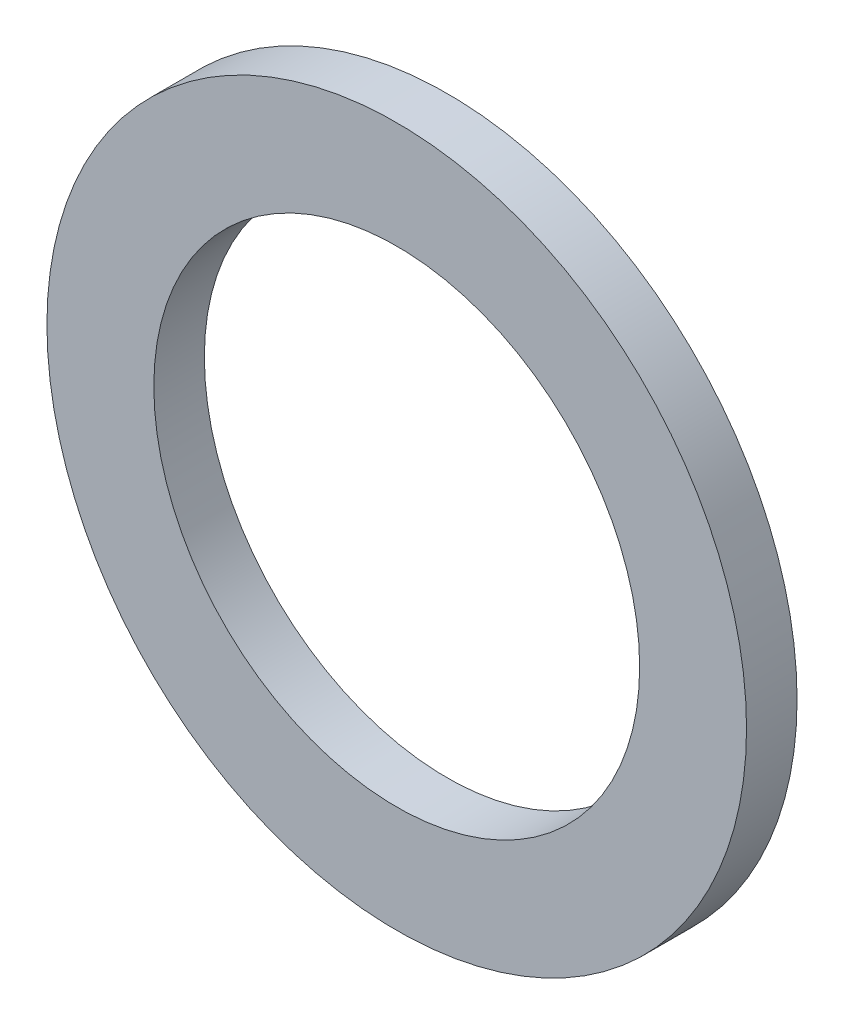
ISO-10303-21;
HEADER;
FILE_DESCRIPTION(('STEP AP214'),'2;1');
FILE_NAME('part.step','',(''),(''),'','','');
FILE_SCHEMA(('AUTOMOTIVE_DESIGN { 1 0 10303 214 1 1 1 1 }'));
ENDSEC;
DATA;
#1=APPLICATION_CONTEXT('core data for automotive mechanical design processes');
#2=APPLICATION_PROTOCOL_DEFINITION('international standard','automotive_design',2000,#1);
#3=PRODUCT_CONTEXT('',#1,'mechanical');
#4=PRODUCT('Part','Part','',(#3));
#5=PRODUCT_RELATED_PRODUCT_CATEGORY('part','',(#4));
#6=PRODUCT_DEFINITION_FORMATION('','',#4);
#7=PRODUCT_DEFINITION_CONTEXT('part definition',#1,'design');
#8=PRODUCT_DEFINITION('design','',#6,#7);
#9=PRODUCT_DEFINITION_SHAPE('','',#8);
#10=(LENGTH_UNIT() NAMED_UNIT(*) SI_UNIT(.MILLI.,.METRE.));
#11=(NAMED_UNIT(*) PLANE_ANGLE_UNIT() SI_UNIT($,.RADIAN.));
#12=(NAMED_UNIT(*) SI_UNIT($,.STERADIAN.) SOLID_ANGLE_UNIT());
#13=UNCERTAINTY_MEASURE_WITH_UNIT(LENGTH_MEASURE(1.E-05),#10,'distance_accuracy_value','');
#14=(GEOMETRIC_REPRESENTATION_CONTEXT(3) GLOBAL_UNCERTAINTY_ASSIGNED_CONTEXT((#13)) GLOBAL_UNIT_ASSIGNED_CONTEXT((#10,
#11,#12)) REPRESENTATION_CONTEXT('',''));
#15=CARTESIAN_POINT('',(0.,0.,0.));
#16=DIRECTION('',(0.,0.,1.));
#17=DIRECTION('',(1.,0.,0.));
#18=AXIS2_PLACEMENT_3D('',#15,#16,#17);
#19=CARTESIAN_POINT('',(0.,0.,1.3));
#20=DIRECTION('',(0.,0.,1.));
#21=DIRECTION('',(1.,0.,0.));
#22=AXIS2_PLACEMENT_3D('',#19,#20,#21);
#23=PLANE('',#22);
#24=CARTESIAN_POINT('',(0.,0.,1.3));
#25=DIRECTION('',(0.,0.,1.));
#26=DIRECTION('',(1.,0.,0.));
#27=AXIS2_PLACEMENT_3D('',#24,#25,#26);
#28=CIRCLE('',#27,9.);
#29=CARTESIAN_POINT('',(9.,0.,1.3));
#30=VERTEX_POINT('',#29);
#31=EDGE_CURVE('E10',#30,#30,#28,.T.);
#32=ORIENTED_EDGE('',*,*,#31,.T.);
#33=EDGE_LOOP('',(#32));
#34=FACE_BOUND('',#33,.T.);
#35=CARTESIAN_POINT('',(0.,0.,1.3));
#36=DIRECTION('',(0.,0.,1.));
#37=DIRECTION('',(1.,0.,0.));
#38=AXIS2_PLACEMENT_3D('',#35,#36,#37);
#39=CIRCLE('',#38,6.25);
#40=CARTESIAN_POINT('',(6.25,0.,1.3));
#41=VERTEX_POINT('',#40);
#42=EDGE_CURVE('E45',#41,#41,#39,.T.);
#43=ORIENTED_EDGE('',*,*,#42,.F.);
#44=EDGE_LOOP('',(#43));
#45=FACE_BOUND('',#44,.T.);
#46=ADVANCED_FACE('F34',(#34,#45),#23,.T.);
#47=CARTESIAN_POINT('',(0.,0.,0.));
#48=DIRECTION('',(0.,0.,1.));
#49=DIRECTION('',(1.,0.,0.));
#50=AXIS2_PLACEMENT_3D('',#47,#48,#49);
#51=PLANE('',#50);
#52=CARTESIAN_POINT('',(0.,0.,0.));
#53=DIRECTION('',(0.,0.,1.));
#54=DIRECTION('',(1.,0.,0.));
#55=AXIS2_PLACEMENT_3D('',#52,#53,#54);
#56=CIRCLE('',#55,9.);
#57=CARTESIAN_POINT('',(9.,0.,0.));
#58=VERTEX_POINT('',#57);
#59=EDGE_CURVE('E38',#58,#58,#56,.T.);
#60=ORIENTED_EDGE('',*,*,#59,.F.);
#61=EDGE_LOOP('',(#60));
#62=FACE_BOUND('',#61,.T.);
#63=CARTESIAN_POINT('',(0.,0.,0.));
#64=DIRECTION('',(0.,0.,1.));
#65=DIRECTION('',(1.,0.,0.));
#66=AXIS2_PLACEMENT_3D('',#63,#64,#65);
#67=CIRCLE('',#66,6.25);
#68=CARTESIAN_POINT('',(6.25,0.,0.));
#69=VERTEX_POINT('',#68);
#70=EDGE_CURVE('E47',#69,#69,#67,.T.);
#71=ORIENTED_EDGE('',*,*,#70,.T.);
#72=EDGE_LOOP('',(#71));
#73=FACE_BOUND('',#72,.T.);
#74=ADVANCED_FACE('F57',(#62,#73),#51,.F.);
#75=CARTESIAN_POINT('',(0.,0.,1.3));
#76=DIRECTION('',(0.,0.,-1.));
#77=DIRECTION('',(-1.,0.,0.));
#78=AXIS2_PLACEMENT_3D('',#75,#76,#77);
#79=CYLINDRICAL_SURFACE('',#78,9.);
#80=ORIENTED_EDGE('',*,*,#31,.F.);
#81=EDGE_LOOP('',(#80));
#82=FACE_BOUND('',#81,.T.);
#83=ORIENTED_EDGE('',*,*,#59,.T.);
#84=EDGE_LOOP('',(#83));
#85=FACE_BOUND('',#84,.T.);
#86=ADVANCED_FACE('F36',(#82,#85),#79,.T.);
#87=CARTESIAN_POINT('',(0.,0.,1.3));
#88=DIRECTION('',(0.,0.,-1.));
#89=DIRECTION('',(-1.,0.,0.));
#90=AXIS2_PLACEMENT_3D('',#87,#88,#89);
#91=CYLINDRICAL_SURFACE('',#90,6.25);
#92=ORIENTED_EDGE('',*,*,#42,.T.);
#93=EDGE_LOOP('',(#92));
#94=FACE_BOUND('',#93,.T.);
#95=ORIENTED_EDGE('',*,*,#70,.F.);
#96=EDGE_LOOP('',(#95));
#97=FACE_BOUND('',#96,.T.);
#98=ADVANCED_FACE('F53',(#94,#97),#91,.F.);
#99=CLOSED_SHELL('',(#46,#74,#86,#98));
#100=MANIFOLD_SOLID_BREP('B2',#99);
#101=ADVANCED_BREP_SHAPE_REPRESENTATION('',(#18,#100),#14);
#102=SHAPE_DEFINITION_REPRESENTATION(#9,#101);
ENDSEC;
END-ISO-10303-21;
